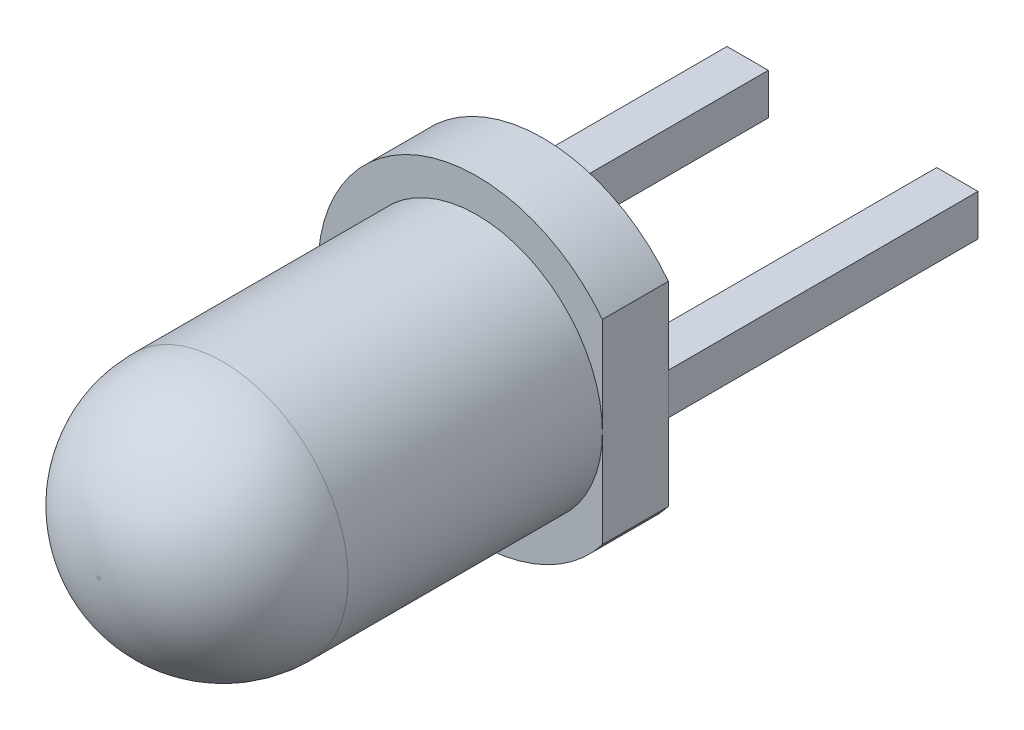
ISO-10303-21;
HEADER;
FILE_DESCRIPTION(('STEP AP214'),'2;1');
FILE_NAME('part.step','',(''),(''),'','','');
FILE_SCHEMA(('AUTOMOTIVE_DESIGN { 1 0 10303 214 1 1 1 1 }'));
ENDSEC;
DATA;
#1=APPLICATION_CONTEXT('core data for automotive mechanical design processes');
#2=APPLICATION_PROTOCOL_DEFINITION('international standard','automotive_design',2000,#1);
#3=PRODUCT_CONTEXT('',#1,'mechanical');
#4=PRODUCT('Part','Part','',(#3));
#5=PRODUCT_RELATED_PRODUCT_CATEGORY('part','',(#4));
#6=PRODUCT_DEFINITION_FORMATION('','',#4);
#7=PRODUCT_DEFINITION_CONTEXT('part definition',#1,'design');
#8=PRODUCT_DEFINITION('design','',#6,#7);
#9=PRODUCT_DEFINITION_SHAPE('','',#8);
#10=(LENGTH_UNIT() NAMED_UNIT(*) SI_UNIT(.MILLI.,.METRE.));
#11=(NAMED_UNIT(*) PLANE_ANGLE_UNIT() SI_UNIT($,.RADIAN.));
#12=(NAMED_UNIT(*) SI_UNIT($,.STERADIAN.) SOLID_ANGLE_UNIT());
#13=UNCERTAINTY_MEASURE_WITH_UNIT(LENGTH_MEASURE(1.E-05),#10,'distance_accuracy_value','');
#14=(GEOMETRIC_REPRESENTATION_CONTEXT(3) GLOBAL_UNCERTAINTY_ASSIGNED_CONTEXT((#13)) GLOBAL_UNIT_ASSIGNED_CONTEXT((#10,
#11,#12)) REPRESENTATION_CONTEXT('',''));
#15=CARTESIAN_POINT('',(0.,0.,0.));
#16=DIRECTION('',(0.,0.,1.));
#17=DIRECTION('',(1.,0.,0.));
#18=AXIS2_PLACEMENT_3D('',#15,#16,#17);
#19=CARTESIAN_POINT('',(0.,0.,5.39));
#20=DIRECTION('',(0.,0.,1.));
#21=DIRECTION('',(1.,0.,0.));
#22=AXIS2_PLACEMENT_3D('',#19,#20,#21);
#23=PLANE('',#22);
#24=CARTESIAN_POINT('',(0.,0.,5.39));
#25=DIRECTION('',(0.,0.,1.));
#26=DIRECTION('',(1.,0.,0.));
#27=AXIS2_PLACEMENT_3D('',#24,#25,#26);
#28=CIRCLE('',#27,0.02);
#29=CARTESIAN_POINT('',(0.02,0.,5.39));
#30=VERTEX_POINT('',#29);
#31=EDGE_CURVE('P0_E11',#30,#30,#28,.T.);
#32=ORIENTED_EDGE('',*,*,#31,.T.);
#33=EDGE_LOOP('',(#32));
#34=FACE_BOUND('',#33,.T.);
#35=ADVANCED_FACE('P0_F16',(#34),#23,.T.);
#36=CARTESIAN_POINT('',(1.52,0.,3.89));
#37=CARTESIAN_POINT('',(1.52,0.,4.125619449019));
#38=CARTESIAN_POINT('',(1.473746610581,0.,4.361242630973));
#39=CARTESIAN_POINT('',(1.381172946414,0.,4.584735226524));
#40=CARTESIAN_POINT('',(1.247268281961,0.,4.784052061599));
#41=CARTESIAN_POINT('',(0.914052061599,0.,5.117268281961));
#42=CARTESIAN_POINT('',(0.714735226524,0.,5.251172946414));
#43=CARTESIAN_POINT('',(0.491242630973,0.,5.343746610581));
#44=CARTESIAN_POINT('',(0.255619449019,0.,5.39));
#45=CARTESIAN_POINT('',(0.02,0.,5.39));
#46=(BOUNDED_CURVE() B_SPLINE_CURVE(5,(#36,#37,#38,#39,#40,#41,#42,#43,#44,#45),.UNSPECIFIED.,
.F.,.F.) B_SPLINE_CURVE_WITH_KNOTS((6,4,6),(0.,0.785398163397,1.570796326795),
.UNSPECIFIED.) CURVE() GEOMETRIC_REPRESENTATION_ITEM() RATIONAL_B_SPLINE_CURVE((1.,1.,1.,1.,1.,
1.,1.,1.,1.,1.)) REPRESENTATION_ITEM(''));
#47=CARTESIAN_POINT('',(0.,0.,3.89));
#48=DIRECTION('',(0.,0.,-1.));
#49=AXIS1_PLACEMENT('',#47,#48);
#50=SURFACE_OF_REVOLUTION('',#46,#49);
#51=CARTESIAN_POINT('',(0.02,0.,3.89));
#52=DIRECTION('',(0.,-1.,0.));
#53=DIRECTION('',(1.,0.,0.));
#54=AXIS2_PLACEMENT_3D('',#51,#52,#53);
#55=CIRCLE('',#54,1.5);
#56=CARTESIAN_POINT('',(1.52,0.,3.89));
#57=VERTEX_POINT('',#56);
#58=EDGE_CURVE('P0_E27',#57,#30,#55,.T.);
#59=ORIENTED_EDGE('',*,*,#58,.F.);
#60=CARTESIAN_POINT('',(0.,0.,3.89));
#61=DIRECTION('',(0.,0.,1.));
#62=DIRECTION('',(1.,0.,0.));
#63=AXIS2_PLACEMENT_3D('',#60,#61,#62);
#64=CIRCLE('',#63,1.52);
#65=EDGE_CURVE('P0_E243',#57,#57,#64,.T.);
#66=ORIENTED_EDGE('',*,*,#65,.T.);
#67=ORIENTED_EDGE('',*,*,#58,.T.);
#68=ORIENTED_EDGE('',*,*,#31,.F.);
#69=EDGE_LOOP('',(#59,#66,#67,#68));
#70=FACE_BOUND('',#69,.T.);
#71=ADVANCED_FACE('P0_F491',(#70),#50,.F.);
#72=CARTESIAN_POINT('',(0.04710743554143,0.,0.01));
#73=DIRECTION('',(0.,0.,-1.));
#74=DIRECTION('',(0.,-1.,0.));
#75=AXIS2_PLACEMENT_3D('',#72,#73,#74);
#76=PLANE('',#75);
#77=DIRECTION('',(1.,0.,0.));
#78=VECTOR('',#77,1.);
#79=CARTESIAN_POINT('',(-1.52,-0.25,0.01));
#80=LINE('',#79,#78);
#81=CARTESIAN_POINT('',(-1.52,-0.25,0.01));
#82=VERTEX_POINT('',#81);
#83=CARTESIAN_POINT('',(-1.02,-0.25,0.01));
#84=VERTEX_POINT('',#83);
#85=EDGE_CURVE('P0_E244',#82,#84,#80,.T.);
#86=ORIENTED_EDGE('',*,*,#85,.F.);
#87=DIRECTION('',(0.,-1.,0.));
#88=VECTOR('',#87,1.);
#89=CARTESIAN_POINT('',(-1.52,0.25,0.01));
#90=LINE('',#89,#88);
#91=CARTESIAN_POINT('',(-1.52,0.25,0.01));
#92=VERTEX_POINT('',#91);
#93=EDGE_CURVE('P0_E367',#92,#82,#90,.T.);
#94=ORIENTED_EDGE('',*,*,#93,.F.);
#95=DIRECTION('',(-1.,0.,0.));
#96=VECTOR('',#95,1.);
#97=CARTESIAN_POINT('',(-1.02,0.25,0.01));
#98=LINE('',#97,#96);
#99=CARTESIAN_POINT('',(-1.02,0.25,0.01));
#100=VERTEX_POINT('',#99);
#101=EDGE_CURVE('P0_E326',#100,#92,#98,.T.);
#102=ORIENTED_EDGE('',*,*,#101,.F.);
#103=DIRECTION('',(0.,1.,0.));
#104=VECTOR('',#103,1.);
#105=CARTESIAN_POINT('',(-1.02,-0.25,0.01));
#106=LINE('',#105,#104);
#107=EDGE_CURVE('P0_E348',#84,#100,#106,.T.);
#108=ORIENTED_EDGE('',*,*,#107,.F.);
#109=EDGE_LOOP('',(#86,#94,#102,#108));
#110=FACE_BOUND('',#109,.T.);
#111=ADVANCED_FACE('P0_F496',(#110),#76,.T.);
#112=CARTESIAN_POINT('',(0.,0.,0.81));
#113=DIRECTION('',(0.,0.,-1.));
#114=DIRECTION('',(1.,0.,0.));
#115=AXIS2_PLACEMENT_3D('',#112,#113,#114);
#116=CYLINDRICAL_SURFACE('',#115,1.52);
#117=CARTESIAN_POINT('',(0.,0.,0.81));
#118=DIRECTION('',(0.,0.,1.));
#119=DIRECTION('',(1.,0.,0.));
#120=AXIS2_PLACEMENT_3D('',#117,#118,#119);
#121=CIRCLE('',#120,1.52);
#122=CARTESIAN_POINT('',(1.52,0.,0.81));
#123=VERTEX_POINT('',#122);
#124=EDGE_CURVE('P0_E274',#123,#123,#121,.T.);
#125=ORIENTED_EDGE('',*,*,#124,.T.);
#126=DIRECTION('',(0.,0.,1.));
#127=VECTOR('',#126,1.);
#128=CARTESIAN_POINT('',(1.52,0.,0.81));
#129=LINE('',#128,#127);
#130=EDGE_CURVE('P0_E239',#123,#57,#129,.T.);
#131=ORIENTED_EDGE('',*,*,#130,.T.);
#132=ORIENTED_EDGE('',*,*,#65,.F.);
#133=ORIENTED_EDGE('',*,*,#130,.F.);
#134=EDGE_LOOP('',(#125,#131,#132,#133));
#135=FACE_BOUND('',#134,.T.);
#136=ADVANCED_FACE('P0_F505',(#135),#116,.T.);
#137=CARTESIAN_POINT('',(-1.52,-0.25,0.01));
#138=DIRECTION('',(0.,1.,0.));
#139=DIRECTION('',(1.,0.,0.));
#140=AXIS2_PLACEMENT_3D('',#137,#138,#139);
#141=PLANE('',#140);
#142=ORIENTED_EDGE('',*,*,#85,.T.);
#143=DIRECTION('',(0.,0.,1.));
#144=VECTOR('',#143,1.);
#145=CARTESIAN_POINT('',(-1.02,-0.25,0.01));
#146=LINE('',#145,#144);
#147=CARTESIAN_POINT('',(-1.02,-0.25,0.011));
#148=VERTEX_POINT('',#147);
#149=EDGE_CURVE('P0_E351',#84,#148,#146,.T.);
#150=ORIENTED_EDGE('',*,*,#149,.T.);
#151=DIRECTION('',(1.,0.,0.));
#152=VECTOR('',#151,1.);
#153=CARTESIAN_POINT('',(-1.52,-0.25,0.011));
#154=LINE('',#153,#152);
#155=CARTESIAN_POINT('',(-1.52,-0.25,0.011));
#156=VERTEX_POINT('',#155);
#157=EDGE_CURVE('P0_E267',#156,#148,#154,.T.);
#158=ORIENTED_EDGE('',*,*,#157,.F.);
#159=DIRECTION('',(0.,0.,1.));
#160=VECTOR('',#159,1.);
#161=CARTESIAN_POINT('',(-1.52,-0.25,0.01));
#162=LINE('',#161,#160);
#163=EDGE_CURVE('P0_E295',#82,#156,#162,.T.);
#164=ORIENTED_EDGE('',*,*,#163,.F.);
#165=EDGE_LOOP('',(#142,#150,#158,#164));
#166=FACE_BOUND('',#165,.T.);
#167=ADVANCED_FACE('P0_F508',(#166),#141,.F.);
#168=CARTESIAN_POINT('',(-1.52,0.25,0.01));
#169=DIRECTION('',(1.,0.,0.));
#170=DIRECTION('',(0.,1.,0.));
#171=AXIS2_PLACEMENT_3D('',#168,#169,#170);
#172=PLANE('',#171);
#173=ORIENTED_EDGE('',*,*,#93,.T.);
#174=ORIENTED_EDGE('',*,*,#163,.T.);
#175=DIRECTION('',(0.,-1.,0.));
#176=VECTOR('',#175,1.);
#177=CARTESIAN_POINT('',(-1.52,0.25,0.011));
#178=LINE('',#177,#176);
#179=CARTESIAN_POINT('',(-1.52,0.25,0.011));
#180=VERTEX_POINT('',#179);
#181=EDGE_CURVE('P0_E334',#180,#156,#178,.T.);
#182=ORIENTED_EDGE('',*,*,#181,.F.);
#183=DIRECTION('',(0.,0.,1.));
#184=VECTOR('',#183,1.);
#185=CARTESIAN_POINT('',(-1.52,0.25,0.01));
#186=LINE('',#185,#184);
#187=EDGE_CURVE('P0_E330',#92,#180,#186,.T.);
#188=ORIENTED_EDGE('',*,*,#187,.F.);
#189=EDGE_LOOP('',(#173,#174,#182,#188));
#190=FACE_BOUND('',#189,.T.);
#191=ADVANCED_FACE('P0_F522',(#190),#172,.F.);
#192=CARTESIAN_POINT('',(-1.02,-0.25,0.01));
#193=DIRECTION('',(-1.,0.,0.));
#194=DIRECTION('',(0.,0.,1.));
#195=AXIS2_PLACEMENT_3D('',#192,#193,#194);
#196=PLANE('',#195);
#197=ORIENTED_EDGE('',*,*,#107,.T.);
#198=DIRECTION('',(0.,0.,1.));
#199=VECTOR('',#198,1.);
#200=CARTESIAN_POINT('',(-1.02,0.25,0.01));
#201=LINE('',#200,#199);
#202=CARTESIAN_POINT('',(-1.02,0.25,0.011));
#203=VERTEX_POINT('',#202);
#204=EDGE_CURVE('P0_E352',#100,#203,#201,.T.);
#205=ORIENTED_EDGE('',*,*,#204,.T.);
#206=DIRECTION('',(0.,1.,0.));
#207=VECTOR('',#206,1.);
#208=CARTESIAN_POINT('',(-1.02,-0.25,0.011));
#209=LINE('',#208,#207);
#210=EDGE_CURVE('P0_E324',#148,#203,#209,.T.);
#211=ORIENTED_EDGE('',*,*,#210,.F.);
#212=ORIENTED_EDGE('',*,*,#149,.F.);
#213=EDGE_LOOP('',(#197,#205,#211,#212));
#214=FACE_BOUND('',#213,.T.);
#215=ADVANCED_FACE('P0_F501',(#214),#196,.F.);
#216=CARTESIAN_POINT('',(-1.02,0.25,0.01));
#217=DIRECTION('',(0.,-1.,0.));
#218=DIRECTION('',(0.,0.,-1.));
#219=AXIS2_PLACEMENT_3D('',#216,#217,#218);
#220=PLANE('',#219);
#221=ORIENTED_EDGE('',*,*,#101,.T.);
#222=ORIENTED_EDGE('',*,*,#187,.T.);
#223=DIRECTION('',(-1.,0.,0.));
#224=VECTOR('',#223,1.);
#225=CARTESIAN_POINT('',(-1.02,0.25,0.011));
#226=LINE('',#225,#224);
#227=EDGE_CURVE('P0_E229',#203,#180,#226,.T.);
#228=ORIENTED_EDGE('',*,*,#227,.F.);
#229=ORIENTED_EDGE('',*,*,#204,.F.);
#230=EDGE_LOOP('',(#221,#222,#228,#229));
#231=FACE_BOUND('',#230,.T.);
#232=ADVANCED_FACE('P0_F550',(#231),#220,.F.);
#233=CARTESIAN_POINT('',(0.04710743554143,0.,0.81));
#234=DIRECTION('',(0.,0.,-1.));
#235=DIRECTION('',(0.,-1.,0.));
#236=AXIS2_PLACEMENT_3D('',#233,#234,#235);
#237=PLANE('',#236);
#238=DIRECTION('',(0.,-1.,0.));
#239=VECTOR('',#238,1.);
#240=CARTESIAN_POINT('',(1.52,1.181196427357,0.81));
#241=LINE('',#240,#239);
#242=CARTESIAN_POINT('',(1.52,-1.181196427357,0.81));
#243=VERTEX_POINT('',#242);
#244=EDGE_CURVE('P0_E223',#123,#243,#241,.T.);
#245=ORIENTED_EDGE('',*,*,#244,.F.);
#246=ORIENTED_EDGE('',*,*,#124,.F.);
#247=DIRECTION('',(0.,-1.,0.));
#248=VECTOR('',#247,1.);
#249=CARTESIAN_POINT('',(1.52,1.181196427357,0.81));
#250=LINE('',#249,#248);
#251=CARTESIAN_POINT('',(1.52,1.181196427357,0.81));
#252=VERTEX_POINT('',#251);
#253=EDGE_CURVE('P0_E218',#252,#123,#250,.T.);
#254=ORIENTED_EDGE('',*,*,#253,.F.);
#255=CARTESIAN_POINT('',(0.,0.,0.81));
#256=DIRECTION('',(0.,0.,1.));
#257=DIRECTION('',(1.,0.,0.));
#258=AXIS2_PLACEMENT_3D('',#255,#256,#257);
#259=CIRCLE('',#258,1.925);
#260=EDGE_CURVE('P0_E307',#252,#243,#259,.T.);
#261=ORIENTED_EDGE('',*,*,#260,.T.);
#262=EDGE_LOOP('',(#245,#246,#254,#261));
#263=FACE_BOUND('',#262,.T.);
#264=ADVANCED_FACE('P0_F553',(#263),#237,.F.);
#265=CARTESIAN_POINT('',(-1.52,-0.349,0.011));
#266=DIRECTION('',(1.,0.,0.));
#267=DIRECTION('',(0.,0.,1.));
#268=AXIS2_PLACEMENT_3D('',#265,#266,#267);
#269=CYLINDRICAL_SURFACE('',#268,0.099);
#270=CARTESIAN_POINT('',(-1.619,-0.349,0.011));
#271=DIRECTION('',(-0.707106781186548,0.707106781186548,0.));
#272=DIRECTION('',(0.707106781186548,0.707106781186548,0.));
#273=AXIS2_PLACEMENT_3D('',#270,#271,#272);
#274=ELLIPSE('',#273,0.140007142675,0.099);
#275=CARTESIAN_POINT('',(-1.619,-0.349,0.11));
#276=VERTEX_POINT('',#275);
#277=EDGE_CURVE('P0_E275',#276,#156,#274,.T.);
#278=ORIENTED_EDGE('',*,*,#277,.T.);
#279=ORIENTED_EDGE('',*,*,#157,.T.);
#280=CARTESIAN_POINT('',(-0.921,-0.349,0.011));
#281=DIRECTION('',(-0.707106781186548,-0.707106781186548,0.));
#282=DIRECTION('',(-0.707106781186548,0.707106781186548,0.));
#283=AXIS2_PLACEMENT_3D('',#280,#281,#282);
#284=ELLIPSE('',#283,0.140007142675,0.099);
#285=CARTESIAN_POINT('',(-0.921,-0.349,0.11));
#286=VERTEX_POINT('',#285);
#287=EDGE_CURVE('P0_E228',#286,#148,#284,.T.);
#288=ORIENTED_EDGE('',*,*,#287,.F.);
#289=DIRECTION('',(1.,0.,0.));
#290=VECTOR('',#289,1.);
#291=CARTESIAN_POINT('',(-1.52,-0.349,0.11));
#292=LINE('',#291,#290);
#293=EDGE_CURVE('P0_E249',#276,#286,#292,.T.);
#294=ORIENTED_EDGE('',*,*,#293,.F.);
#295=EDGE_LOOP('',(#278,#279,#288,#294));
#296=FACE_BOUND('',#295,.T.);
#297=ADVANCED_FACE('P0_F516',(#296),#269,.F.);
#298=CARTESIAN_POINT('',(-1.619,0.25,0.011));
#299=DIRECTION('',(0.,-1.,0.));
#300=DIRECTION('',(0.,0.,1.));
#301=AXIS2_PLACEMENT_3D('',#298,#299,#300);
#302=CYLINDRICAL_SURFACE('',#301,0.099);
#303=CARTESIAN_POINT('',(-1.619,0.349,0.011));
#304=DIRECTION('',(0.707106781186548,0.707106781186548,0.));
#305=DIRECTION('',(-0.707106781186548,0.707106781186548,0.));
#306=AXIS2_PLACEMENT_3D('',#303,#304,#305);
#307=ELLIPSE('',#306,0.140007142675,0.099);
#308=CARTESIAN_POINT('',(-1.619,0.349,0.11));
#309=VERTEX_POINT('',#308);
#310=EDGE_CURVE('P0_E224',#309,#180,#307,.T.);
#311=ORIENTED_EDGE('',*,*,#310,.T.);
#312=ORIENTED_EDGE('',*,*,#181,.T.);
#313=ORIENTED_EDGE('',*,*,#277,.F.);
#314=DIRECTION('',(0.,-1.,0.));
#315=VECTOR('',#314,1.);
#316=CARTESIAN_POINT('',(-1.619,0.25,0.11));
#317=LINE('',#316,#315);
#318=EDGE_CURVE('P0_E254',#309,#276,#317,.T.);
#319=ORIENTED_EDGE('',*,*,#318,.F.);
#320=EDGE_LOOP('',(#311,#312,#313,#319));
#321=FACE_BOUND('',#320,.T.);
#322=ADVANCED_FACE('P0_F512',(#321),#302,.F.);
#323=CARTESIAN_POINT('',(-0.921,-0.25,0.011));
#324=DIRECTION('',(0.,1.,0.));
#325=DIRECTION('',(0.,0.,1.));
#326=AXIS2_PLACEMENT_3D('',#323,#324,#325);
#327=CYLINDRICAL_SURFACE('',#326,0.099);
#328=ORIENTED_EDGE('',*,*,#287,.T.);
#329=ORIENTED_EDGE('',*,*,#210,.T.);
#330=CARTESIAN_POINT('',(-0.921,0.349,0.011));
#331=DIRECTION('',(0.707106781186548,-0.707106781186548,0.));
#332=DIRECTION('',(-0.707106781186548,-0.707106781186548,0.));
#333=AXIS2_PLACEMENT_3D('',#330,#331,#332);
#334=ELLIPSE('',#333,0.140007142675,0.099);
#335=CARTESIAN_POINT('',(-0.921,0.349,0.11));
#336=VERTEX_POINT('',#335);
#337=EDGE_CURVE('P0_E337',#336,#203,#334,.T.);
#338=ORIENTED_EDGE('',*,*,#337,.F.);
#339=DIRECTION('',(0.,1.,0.));
#340=VECTOR('',#339,1.);
#341=CARTESIAN_POINT('',(-0.921,-0.25,0.11));
#342=LINE('',#341,#340);
#343=EDGE_CURVE('P0_E253',#286,#336,#342,.T.);
#344=ORIENTED_EDGE('',*,*,#343,.F.);
#345=EDGE_LOOP('',(#328,#329,#338,#344));
#346=FACE_BOUND('',#345,.T.);
#347=ADVANCED_FACE('P0_F515',(#346),#327,.F.);
#348=CARTESIAN_POINT('',(-1.02,0.349,0.011));
#349=DIRECTION('',(-1.,0.,0.));
#350=DIRECTION('',(0.,0.,1.));
#351=AXIS2_PLACEMENT_3D('',#348,#349,#350);
#352=CYLINDRICAL_SURFACE('',#351,0.099);
#353=ORIENTED_EDGE('',*,*,#337,.T.);
#354=ORIENTED_EDGE('',*,*,#227,.T.);
#355=ORIENTED_EDGE('',*,*,#310,.F.);
#356=DIRECTION('',(-1.,0.,0.));
#357=VECTOR('',#356,1.);
#358=CARTESIAN_POINT('',(-1.02,0.349,0.11));
#359=LINE('',#358,#357);
#360=EDGE_CURVE('P0_E255',#336,#309,#359,.T.);
#361=ORIENTED_EDGE('',*,*,#360,.F.);
#362=EDGE_LOOP('',(#353,#354,#355,#361));
#363=FACE_BOUND('',#362,.T.);
#364=ADVANCED_FACE('P0_F548',(#363),#352,.F.);
#365=CARTESIAN_POINT('',(0.921,-0.25,0.011));
#366=DIRECTION('',(0.,1.,0.));
#367=DIRECTION('',(1.,0.,0.));
#368=AXIS2_PLACEMENT_3D('',#365,#366,#367);
#369=CYLINDRICAL_SURFACE('',#368,0.099);
#370=CARTESIAN_POINT('',(0.921,-0.349,0.011));
#371=DIRECTION('',(0.707106781186548,-0.707106781186548,0.));
#372=DIRECTION('',(0.707106781186548,0.707106781186548,0.));
#373=AXIS2_PLACEMENT_3D('',#370,#371,#372);
#374=ELLIPSE('',#373,0.140007142675,0.099);
#375=CARTESIAN_POINT('',(1.02,-0.25,0.011));
#376=VERTEX_POINT('',#375);
#377=CARTESIAN_POINT('',(0.921,-0.349,0.11));
#378=VERTEX_POINT('',#377);
#379=EDGE_CURVE('P0_E405',#376,#378,#374,.T.);
#380=ORIENTED_EDGE('',*,*,#379,.T.);
#381=DIRECTION('',(0.,1.,0.));
#382=VECTOR('',#381,1.);
#383=CARTESIAN_POINT('',(0.921,-0.25,0.11));
#384=LINE('',#383,#382);
#385=CARTESIAN_POINT('',(0.921,0.349,0.11));
#386=VERTEX_POINT('',#385);
#387=EDGE_CURVE('P0_E238',#378,#386,#384,.T.);
#388=ORIENTED_EDGE('',*,*,#387,.T.);
#389=CARTESIAN_POINT('',(0.921,0.349,0.011));
#390=DIRECTION('',(-0.707106781186548,-0.707106781186548,0.));
#391=DIRECTION('',(-0.707106781186548,0.707106781186548,0.));
#392=AXIS2_PLACEMENT_3D('',#389,#390,#391);
#393=ELLIPSE('',#392,0.140007142675,0.099);
#394=CARTESIAN_POINT('',(1.02,0.25,0.011));
#395=VERTEX_POINT('',#394);
#396=EDGE_CURVE('P0_E20',#395,#386,#393,.T.);
#397=ORIENTED_EDGE('',*,*,#396,.F.);
#398=DIRECTION('',(0.,1.,0.));
#399=VECTOR('',#398,1.);
#400=CARTESIAN_POINT('',(1.02,-0.25,0.011));
#401=LINE('',#400,#399);
#402=EDGE_CURVE('P0_E306',#376,#395,#401,.T.);
#403=ORIENTED_EDGE('',*,*,#402,.F.);
#404=EDGE_LOOP('',(#380,#388,#397,#403));
#405=FACE_BOUND('',#404,.T.);
#406=ADVANCED_FACE('P0_F18',(#405),#369,.F.);
#407=CARTESIAN_POINT('',(1.02,0.349,0.011));
#408=DIRECTION('',(1.,0.,0.));
#409=DIRECTION('',(0.,-1.,0.));
#410=AXIS2_PLACEMENT_3D('',#407,#408,#409);
#411=CYLINDRICAL_SURFACE('',#410,0.099);
#412=ORIENTED_EDGE('',*,*,#396,.T.);
#413=DIRECTION('',(1.,0.,0.));
#414=VECTOR('',#413,1.);
#415=CARTESIAN_POINT('',(1.02,0.349,0.11));
#416=LINE('',#415,#414);
#417=CARTESIAN_POINT('',(1.321,0.349,0.11));
#418=VERTEX_POINT('',#417);
#419=EDGE_CURVE('P0_E234',#386,#418,#416,.T.);
#420=ORIENTED_EDGE('',*,*,#419,.T.);
#421=CARTESIAN_POINT('',(1.321,0.349,0.011));
#422=DIRECTION('',(-0.707106781186548,-0.707106781186548,0.));
#423=DIRECTION('',(-0.707106781186548,0.707106781186548,0.));
#424=AXIS2_PLACEMENT_3D('',#421,#422,#423);
#425=ELLIPSE('',#424,0.140007142675,0.099);
#426=CARTESIAN_POINT('',(1.42,0.25,0.011));
#427=VERTEX_POINT('',#426);
#428=EDGE_CURVE('P0_E219',#427,#418,#425,.T.);
#429=ORIENTED_EDGE('',*,*,#428,.F.);
#430=DIRECTION('',(1.,0.,0.));
#431=VECTOR('',#430,1.);
#432=CARTESIAN_POINT('',(1.02,0.25,0.011));
#433=LINE('',#432,#431);
#434=EDGE_CURVE('P0_E304',#395,#427,#433,.T.);
#435=ORIENTED_EDGE('',*,*,#434,.F.);
#436=EDGE_LOOP('',(#412,#420,#429,#435));
#437=FACE_BOUND('',#436,.T.);
#438=ADVANCED_FACE('P0_F474',(#437),#411,.F.);
#439=CARTESIAN_POINT('',(1.42,-0.349,0.011));
#440=DIRECTION('',(-1.,0.,0.));
#441=DIRECTION('',(0.,1.,0.));
#442=AXIS2_PLACEMENT_3D('',#439,#440,#441);
#443=CYLINDRICAL_SURFACE('',#442,0.099);
#444=CARTESIAN_POINT('',(1.321,-0.349,0.011));
#445=DIRECTION('',(0.707106781186548,-0.707106781186548,0.));
#446=DIRECTION('',(0.707106781186548,0.707106781186548,0.));
#447=AXIS2_PLACEMENT_3D('',#444,#445,#446);
#448=ELLIPSE('',#447,0.140007142675,0.099);
#449=CARTESIAN_POINT('',(1.42,-0.25,0.011));
#450=VERTEX_POINT('',#449);
#451=CARTESIAN_POINT('',(1.321,-0.349,0.11));
#452=VERTEX_POINT('',#451);
#453=EDGE_CURVE('P0_E359',#450,#452,#448,.T.);
#454=ORIENTED_EDGE('',*,*,#453,.T.);
#455=DIRECTION('',(-1.,0.,0.));
#456=VECTOR('',#455,1.);
#457=CARTESIAN_POINT('',(1.42,-0.349,0.11));
#458=LINE('',#457,#456);
#459=EDGE_CURVE('P0_E259',#452,#378,#458,.T.);
#460=ORIENTED_EDGE('',*,*,#459,.T.);
#461=ORIENTED_EDGE('',*,*,#379,.F.);
#462=DIRECTION('',(-1.,0.,0.));
#463=VECTOR('',#462,1.);
#464=CARTESIAN_POINT('',(1.42,-0.25,0.011));
#465=LINE('',#464,#463);
#466=EDGE_CURVE('P0_E180',#450,#376,#465,.T.);
#467=ORIENTED_EDGE('',*,*,#466,.F.);
#468=EDGE_LOOP('',(#454,#460,#461,#467));
#469=FACE_BOUND('',#468,.T.);
#470=ADVANCED_FACE('P0_F479',(#469),#443,.F.);
#471=CARTESIAN_POINT('',(1.02,-0.25,0.01));
#472=DIRECTION('',(-1.,0.,0.));
#473=DIRECTION('',(0.,0.,1.));
#474=AXIS2_PLACEMENT_3D('',#471,#472,#473);
#475=PLANE('',#474);
#476=DIRECTION('',(0.,0.,1.));
#477=VECTOR('',#476,1.);
#478=CARTESIAN_POINT('',(1.02,-0.25,0.01));
#479=LINE('',#478,#477);
#480=CARTESIAN_POINT('',(1.02,-0.25,0.01));
#481=VERTEX_POINT('',#480);
#482=EDGE_CURVE('P0_E173',#481,#376,#479,.T.);
#483=ORIENTED_EDGE('',*,*,#482,.T.);
#484=ORIENTED_EDGE('',*,*,#402,.T.);
#485=DIRECTION('',(0.,0.,1.));
#486=VECTOR('',#485,1.);
#487=CARTESIAN_POINT('',(1.02,0.25,0.01));
#488=LINE('',#487,#486);
#489=CARTESIAN_POINT('',(1.02,0.25,0.01));
#490=VERTEX_POINT('',#489);
#491=EDGE_CURVE('P0_E190',#490,#395,#488,.T.);
#492=ORIENTED_EDGE('',*,*,#491,.F.);
#493=DIRECTION('',(0.,1.,0.));
#494=VECTOR('',#493,1.);
#495=CARTESIAN_POINT('',(1.02,-0.25,0.01));
#496=LINE('',#495,#494);
#497=EDGE_CURVE('P0_E187',#481,#490,#496,.T.);
#498=ORIENTED_EDGE('',*,*,#497,.F.);
#499=EDGE_LOOP('',(#483,#484,#492,#498));
#500=FACE_BOUND('',#499,.T.);
#501=ADVANCED_FACE('P0_F188',(#500),#475,.T.);
#502=CARTESIAN_POINT('',(1.02,0.25,0.01));
#503=DIRECTION('',(0.,1.,0.));
#504=DIRECTION('',(1.,0.,0.));
#505=AXIS2_PLACEMENT_3D('',#502,#503,#504);
#506=PLANE('',#505);
#507=ORIENTED_EDGE('',*,*,#491,.T.);
#508=ORIENTED_EDGE('',*,*,#434,.T.);
#509=DIRECTION('',(0.,0.,1.));
#510=VECTOR('',#509,1.);
#511=CARTESIAN_POINT('',(1.42,0.25,0.01));
#512=LINE('',#511,#510);
#513=CARTESIAN_POINT('',(1.42,0.25,0.01));
#514=VERTEX_POINT('',#513);
#515=EDGE_CURVE('P0_E342',#514,#427,#512,.T.);
#516=ORIENTED_EDGE('',*,*,#515,.F.);
#517=DIRECTION('',(1.,0.,0.));
#518=VECTOR('',#517,1.);
#519=CARTESIAN_POINT('',(1.02,0.25,0.01));
#520=LINE('',#519,#518);
#521=EDGE_CURVE('P0_E195',#490,#514,#520,.T.);
#522=ORIENTED_EDGE('',*,*,#521,.F.);
#523=EDGE_LOOP('',(#507,#508,#516,#522));
#524=FACE_BOUND('',#523,.T.);
#525=ADVANCED_FACE('P0_F473',(#524),#506,.T.);
#526=CARTESIAN_POINT('',(0.,0.,0.01));
#527=DIRECTION('',(0.,0.,-1.));
#528=DIRECTION('',(1.,0.,0.));
#529=AXIS2_PLACEMENT_3D('',#526,#527,#528);
#530=CYLINDRICAL_SURFACE('',#529,1.925);
#531=CARTESIAN_POINT('',(0.,0.,0.01));
#532=DIRECTION('',(0.,0.,1.));
#533=DIRECTION('',(1.,0.,0.));
#534=AXIS2_PLACEMENT_3D('',#531,#532,#533);
#535=CIRCLE('',#534,1.925);
#536=CARTESIAN_POINT('',(1.52,1.181196427357,0.01));
#537=VERTEX_POINT('',#536);
#538=CARTESIAN_POINT('',(1.52,-1.181196427357,0.01));
#539=VERTEX_POINT('',#538);
#540=EDGE_CURVE('P0_E203',#537,#539,#535,.T.);
#541=ORIENTED_EDGE('',*,*,#540,.T.);
#542=DIRECTION('',(0.,0.,1.));
#543=VECTOR('',#542,1.);
#544=CARTESIAN_POINT('',(1.52,-1.181196427357,0.01));
#545=LINE('',#544,#543);
#546=EDGE_CURVE('P0_E233',#539,#243,#545,.T.);
#547=ORIENTED_EDGE('',*,*,#546,.T.);
#548=ORIENTED_EDGE('',*,*,#260,.F.);
#549=DIRECTION('',(0.,0.,1.));
#550=VECTOR('',#549,1.);
#551=CARTESIAN_POINT('',(1.52,1.181196427357,0.01));
#552=LINE('',#551,#550);
#553=EDGE_CURVE('P0_E214',#537,#252,#552,.T.);
#554=ORIENTED_EDGE('',*,*,#553,.F.);
#555=EDGE_LOOP('',(#541,#547,#548,#554));
#556=FACE_BOUND('',#555,.T.);
#557=ADVANCED_FACE('P0_F529',(#556),#530,.T.);
#558=CARTESIAN_POINT('',(1.52,1.181196427357,0.01));
#559=DIRECTION('',(1.,0.,0.));
#560=DIRECTION('',(0.,1.,0.));
#561=AXIS2_PLACEMENT_3D('',#558,#559,#560);
#562=PLANE('',#561);
#563=ORIENTED_EDGE('',*,*,#553,.T.);
#564=ORIENTED_EDGE('',*,*,#253,.T.);
#565=ORIENTED_EDGE('',*,*,#244,.T.);
#566=ORIENTED_EDGE('',*,*,#546,.F.);
#567=DIRECTION('',(0.,-1.,0.));
#568=VECTOR('',#567,1.);
#569=CARTESIAN_POINT('',(1.52,1.181196427357,0.01));
#570=LINE('',#569,#568);
#571=EDGE_CURVE('P0_E210',#537,#539,#570,.T.);
#572=ORIENTED_EDGE('',*,*,#571,.F.);
#573=EDGE_LOOP('',(#563,#564,#565,#566,#572));
#574=FACE_BOUND('',#573,.T.);
#575=ADVANCED_FACE('P0_F527',(#574),#562,.T.);
#576=CARTESIAN_POINT('',(1.321,0.25,0.011));
#577=DIRECTION('',(0.,1.,0.));
#578=DIRECTION('',(1.,0.,0.));
#579=AXIS2_PLACEMENT_3D('',#576,#577,#578);
#580=CYLINDRICAL_SURFACE('',#579,0.099);
#581=ORIENTED_EDGE('',*,*,#428,.T.);
#582=DIRECTION('',(0.,1.,0.));
#583=VECTOR('',#582,1.);
#584=CARTESIAN_POINT('',(1.321,0.25,0.11));
#585=LINE('',#584,#583);
#586=CARTESIAN_POINT('',(1.321,1.110871279672,0.11));
#587=VERTEX_POINT('',#586);
#588=EDGE_CURVE('P0_E184',#418,#587,#585,.T.);
#589=ORIENTED_EDGE('',*,*,#588,.T.);
#590=CARTESIAN_POINT('',(1.42,1.146396528257,0.011));
#591=CARTESIAN_POINT('',(1.419999998987,1.146396526287,0.03125876072404));
#592=CARTESIAN_POINT('',(1.415163403371,1.14468787317,0.05151873587734));
#593=CARTESIAN_POINT('',(1.405489350111,1.141270101434,0.07039024741974));
#594=CARTESIAN_POINT('',(1.391478382053,1.136304591358,0.08648439233626));
#595=CARTESIAN_POINT('',(1.374130100074,1.130110658325,0.09866255670713));
#596=CARTESIAN_POINT('',(1.354746788412,1.123130825513,0.10624687926518));
#597=CARTESIAN_POINT('',(1.332753388435,1.115148305203,0.10931943723926));
#598=CARTESIAN_POINT('',(1.330802867535,1.114439841167,0.10954607495158));
#599=CARTESIAN_POINT('',(1.32884732283,1.11372902605,0.10972755842079));
#600=CARTESIAN_POINT('',(1.326888006457,1.113016309057,0.10986375763367));
#601=CARTESIAN_POINT('',(1.324926174052,1.112302142017,0.10995458593684));
#602=CARTESIAN_POINT('',(1.322963084756,1.111586979382,0.110000000037));
#603=CARTESIAN_POINT('',(1.321000001212,1.110871278231,0.11));
#604=(BOUNDED_CURVE() B_SPLINE_CURVE(7,(#590,#591,#592,#593,#594,#595,#596,#597,#598,#599,#600,
#601,#602,#603),.UNSPECIFIED.,.F.,.F.) B_SPLINE_CURVE_WITH_KNOTS((8,6,8),(0.,0.911598549296,1.),
.UNSPECIFIED.) CURVE() GEOMETRIC_REPRESENTATION_ITEM() RATIONAL_B_SPLINE_CURVE((1.,1.,1.,1.,1.,
1.,1.,1.,1.,1.,1.,1.,1.,1.)) REPRESENTATION_ITEM(''));
#605=CARTESIAN_POINT('',(1.42,1.146396528257,0.011));
#606=VERTEX_POINT('',#605);
#607=EDGE_CURVE('P0_E260',#606,#587,#604,.T.);
#608=ORIENTED_EDGE('',*,*,#607,.F.);
#609=DIRECTION('',(0.,1.,0.));
#610=VECTOR('',#609,1.);
#611=CARTESIAN_POINT('',(1.42,0.25,0.011));
#612=LINE('',#611,#610);
#613=EDGE_CURVE('P0_E346',#427,#606,#612,.T.);
#614=ORIENTED_EDGE('',*,*,#613,.F.);
#615=EDGE_LOOP('',(#581,#589,#608,#614));
#616=FACE_BOUND('',#615,.T.);
#617=ADVANCED_FACE('P0_F461',(#616),#580,.F.);
#618=CARTESIAN_POINT('',(0.106221193918,0.,0.11));
#619=DIRECTION('',(0.,0.,-1.));
#620=DIRECTION('',(0.,-1.,0.));
#621=AXIS2_PLACEMENT_3D('',#618,#619,#620);
#622=PLANE('',#621);
#623=ORIENTED_EDGE('',*,*,#360,.T.);
#624=ORIENTED_EDGE('',*,*,#318,.T.);
#625=ORIENTED_EDGE('',*,*,#293,.T.);
#626=ORIENTED_EDGE('',*,*,#343,.T.);
#627=EDGE_LOOP('',(#623,#624,#625,#626));
#628=FACE_BOUND('',#627,.T.);
#629=CARTESIAN_POINT('',(0.,0.,0.11));
#630=DIRECTION('',(0.,0.,-1.));
#631=DIRECTION('',(0.778082191780786,-0.628162481236828,0.));
#632=AXIS2_PLACEMENT_3D('',#629,#630,#631);
#633=CIRCLE('',#632,1.726);
#634=CARTESIAN_POINT('',(1.321,-1.110871279672,0.11));
#635=VERTEX_POINT('',#634);
#636=EDGE_CURVE('P0_E266',#635,#587,#633,.T.);
#637=ORIENTED_EDGE('',*,*,#636,.T.);
#638=ORIENTED_EDGE('',*,*,#588,.F.);
#639=ORIENTED_EDGE('',*,*,#419,.F.);
#640=ORIENTED_EDGE('',*,*,#387,.F.);
#641=ORIENTED_EDGE('',*,*,#459,.F.);
#642=DIRECTION('',(0.,1.,0.));
#643=VECTOR('',#642,1.);
#644=CARTESIAN_POINT('',(1.321,-1.146396528257,0.11));
#645=LINE('',#644,#643);
#646=EDGE_CURVE('P0_E355',#635,#452,#645,.T.);
#647=ORIENTED_EDGE('',*,*,#646,.F.);
#648=EDGE_LOOP('',(#637,#638,#639,#640,#641,#647));
#649=FACE_BOUND('',#648,.T.);
#650=ADVANCED_FACE('P0_F466',(#628,#649),#622,.T.);
#651=CARTESIAN_POINT('',(1.42,-0.25,0.01));
#652=DIRECTION('',(0.,-1.,0.));
#653=DIRECTION('',(0.,0.,-1.));
#654=AXIS2_PLACEMENT_3D('',#651,#652,#653);
#655=PLANE('',#654);
#656=DIRECTION('',(0.,0.,1.));
#657=VECTOR('',#656,1.);
#658=CARTESIAN_POINT('',(1.42,-0.25,0.01));
#659=LINE('',#658,#657);
#660=CARTESIAN_POINT('',(1.42,-0.25,0.01));
#661=VERTEX_POINT('',#660);
#662=EDGE_CURVE('P0_E248',#661,#450,#659,.T.);
#663=ORIENTED_EDGE('',*,*,#662,.T.);
#664=ORIENTED_EDGE('',*,*,#466,.T.);
#665=ORIENTED_EDGE('',*,*,#482,.F.);
#666=DIRECTION('',(-1.,0.,0.));
#667=VECTOR('',#666,1.);
#668=CARTESIAN_POINT('',(1.42,-0.25,0.01));
#669=LINE('',#668,#667);
#670=EDGE_CURVE('P0_E178',#661,#481,#669,.T.);
#671=ORIENTED_EDGE('',*,*,#670,.F.);
#672=EDGE_LOOP('',(#663,#664,#665,#671));
#673=FACE_BOUND('',#672,.T.);
#674=ADVANCED_FACE('P0_F176',(#673),#655,.T.);
#675=CARTESIAN_POINT('',(1.321,-1.146396528257,0.011));
#676=DIRECTION('',(0.,1.,0.));
#677=DIRECTION('',(1.,0.,0.));
#678=AXIS2_PLACEMENT_3D('',#675,#676,#677);
#679=CYLINDRICAL_SURFACE('',#678,0.099);
#680=CARTESIAN_POINT('',(1.42,-1.146396528257,0.011));
#681=CARTESIAN_POINT('',(1.419999998889,-1.146396526096,0.03322318387792));
#682=CARTESIAN_POINT('',(1.414179941378,-1.144340442402,0.05544795657592));
#683=CARTESIAN_POINT('',(1.402538606567,-1.140227613385,0.07584018826717));
#684=CARTESIAN_POINT('',(1.385800418067,-1.134291663529,0.09256529242793));
#685=CARTESIAN_POINT('',(1.365414407119,-1.126995015846,0.10418858395967));
#686=CARTESIAN_POINT('',(1.343206372936,-1.118967243934,0.110000040068));
#687=CARTESIAN_POINT('',(1.320999999937,-1.110871279747,0.11));
#688=(BOUNDED_CURVE() B_SPLINE_CURVE(7,(#680,#681,#682,#683,#684,#685,#686,#687),.UNSPECIFIED.,
.F.,.F.) B_SPLINE_CURVE_WITH_KNOTS((8,8),(0.,1.),
.UNSPECIFIED.) CURVE() GEOMETRIC_REPRESENTATION_ITEM() RATIONAL_B_SPLINE_CURVE((1.,1.,1.,1.,1.,
1.,1.,1.)) REPRESENTATION_ITEM(''));
#689=CARTESIAN_POINT('',(1.42,-1.146396528257,0.011));
#690=VERTEX_POINT('',#689);
#691=EDGE_CURVE('P0_E247',#690,#635,#688,.T.);
#692=ORIENTED_EDGE('',*,*,#691,.T.);
#693=ORIENTED_EDGE('',*,*,#646,.T.);
#694=ORIENTED_EDGE('',*,*,#453,.F.);
#695=DIRECTION('',(0.,1.,0.));
#696=VECTOR('',#695,1.);
#697=CARTESIAN_POINT('',(1.42,-1.146396528257,0.011));
#698=LINE('',#697,#696);
#699=EDGE_CURVE('P0_E300',#690,#450,#698,.T.);
#700=ORIENTED_EDGE('',*,*,#699,.F.);
#701=EDGE_LOOP('',(#692,#693,#694,#700));
#702=FACE_BOUND('',#701,.T.);
#703=ADVANCED_FACE('P0_F468',(#702),#679,.F.);
#704=CARTESIAN_POINT('',(1.42,0.25,0.01));
#705=DIRECTION('',(-1.,0.,0.));
#706=DIRECTION('',(0.,0.,1.));
#707=AXIS2_PLACEMENT_3D('',#704,#705,#706);
#708=PLANE('',#707);
#709=ORIENTED_EDGE('',*,*,#515,.T.);
#710=ORIENTED_EDGE('',*,*,#613,.T.);
#711=DIRECTION('',(0.,0.,1.));
#712=VECTOR('',#711,1.);
#713=CARTESIAN_POINT('',(1.42,1.146396528257,0.01));
#714=LINE('',#713,#712);
#715=CARTESIAN_POINT('',(1.42,1.146396528257,0.01));
#716=VERTEX_POINT('',#715);
#717=EDGE_CURVE('P0_E276',#716,#606,#714,.T.);
#718=ORIENTED_EDGE('',*,*,#717,.F.);
#719=DIRECTION('',(0.,1.,0.));
#720=VECTOR('',#719,1.);
#721=CARTESIAN_POINT('',(1.42,0.25,0.01));
#722=LINE('',#721,#720);
#723=EDGE_CURVE('P0_E347',#514,#716,#722,.T.);
#724=ORIENTED_EDGE('',*,*,#723,.F.);
#725=EDGE_LOOP('',(#709,#710,#718,#724));
#726=FACE_BOUND('',#725,.T.);
#727=ADVANCED_FACE('P0_F458',(#726),#708,.T.);
#728=CARTESIAN_POINT('',(0.04710743554143,0.,0.01));
#729=DIRECTION('',(0.,0.,-1.));
#730=DIRECTION('',(0.,-1.,0.));
#731=AXIS2_PLACEMENT_3D('',#728,#729,#730);
#732=PLANE('',#731);
#733=CARTESIAN_POINT('',(0.,0.,0.01));
#734=DIRECTION('',(0.,0.,-1.));
#735=DIRECTION('',(1.,0.,0.));
#736=AXIS2_PLACEMENT_3D('',#733,#734,#735);
#737=CIRCLE('',#736,1.825);
#738=CARTESIAN_POINT('',(1.42,-1.146396528257,0.01));
#739=VERTEX_POINT('',#738);
#740=EDGE_CURVE('P0_E281',#739,#716,#737,.T.);
#741=ORIENTED_EDGE('',*,*,#740,.F.);
#742=DIRECTION('',(0.,1.,0.));
#743=VECTOR('',#742,1.);
#744=CARTESIAN_POINT('',(1.42,-1.146396528257,0.01));
#745=LINE('',#744,#743);
#746=EDGE_CURVE('P0_E200',#739,#661,#745,.T.);
#747=ORIENTED_EDGE('',*,*,#746,.T.);
#748=ORIENTED_EDGE('',*,*,#670,.T.);
#749=ORIENTED_EDGE('',*,*,#497,.T.);
#750=ORIENTED_EDGE('',*,*,#521,.T.);
#751=ORIENTED_EDGE('',*,*,#723,.T.);
#752=EDGE_LOOP('',(#741,#747,#748,#749,#750,#751));
#753=FACE_BOUND('',#752,.T.);
#754=ORIENTED_EDGE('',*,*,#571,.T.);
#755=ORIENTED_EDGE('',*,*,#540,.F.);
#756=EDGE_LOOP('',(#754,#755));
#757=FACE_BOUND('',#756,.T.);
#758=ADVANCED_FACE('P0_F198',(#753,#757),#732,.T.);
#759=CARTESIAN_POINT('',(0.,0.,0.011));
#760=DIRECTION('',(0.,0.,1.));
#761=DIRECTION('',(0.778082191780786,-0.628162481236828,0.));
#762=AXIS2_PLACEMENT_3D('',#759,#760,#761);
#763=TOROIDAL_SURFACE('',#762,1.726,0.099);
#764=ORIENTED_EDGE('',*,*,#691,.F.);
#765=CARTESIAN_POINT('',(0.,0.,0.011));
#766=DIRECTION('',(0.,0.,-1.));
#767=DIRECTION('',(0.778082191780786,-0.628162481236828,0.));
#768=AXIS2_PLACEMENT_3D('',#765,#766,#767);
#769=CIRCLE('',#768,1.825);
#770=EDGE_CURVE('P0_E280',#690,#606,#769,.T.);
#771=ORIENTED_EDGE('',*,*,#770,.T.);
#772=ORIENTED_EDGE('',*,*,#607,.T.);
#773=ORIENTED_EDGE('',*,*,#636,.F.);
#774=EDGE_LOOP('',(#764,#771,#772,#773));
#775=FACE_BOUND('',#774,.T.);
#776=ADVANCED_FACE('P0_F448',(#775),#763,.F.);
#777=CARTESIAN_POINT('',(1.42,-1.146396528257,0.01));
#778=DIRECTION('',(-1.,0.,0.));
#779=DIRECTION('',(0.,0.,1.));
#780=AXIS2_PLACEMENT_3D('',#777,#778,#779);
#781=PLANE('',#780);
#782=DIRECTION('',(0.,0.,1.));
#783=VECTOR('',#782,1.);
#784=CARTESIAN_POINT('',(1.42,-1.146396528257,0.01));
#785=LINE('',#784,#783);
#786=EDGE_CURVE('P0_E296',#739,#690,#785,.T.);
#787=ORIENTED_EDGE('',*,*,#786,.T.);
#788=ORIENTED_EDGE('',*,*,#699,.T.);
#789=ORIENTED_EDGE('',*,*,#662,.F.);
#790=ORIENTED_EDGE('',*,*,#746,.F.);
#791=EDGE_LOOP('',(#787,#788,#789,#790));
#792=FACE_BOUND('',#791,.T.);
#793=ADVANCED_FACE('P0_F471',(#792),#781,.T.);
#794=CARTESIAN_POINT('',(0.,0.,0.01));
#795=DIRECTION('',(0.,0.,-1.));
#796=DIRECTION('',(1.,0.,0.));
#797=AXIS2_PLACEMENT_3D('',#794,#795,#796);
#798=CYLINDRICAL_SURFACE('',#797,1.825);
#799=ORIENTED_EDGE('',*,*,#740,.T.);
#800=ORIENTED_EDGE('',*,*,#717,.T.);
#801=ORIENTED_EDGE('',*,*,#770,.F.);
#802=ORIENTED_EDGE('',*,*,#786,.F.);
#803=EDGE_LOOP('',(#799,#800,#801,#802));
#804=FACE_BOUND('',#803,.T.);
#805=ADVANCED_FACE('P0_F455',(#804),#798,.F.);
#806=CLOSED_SHELL('',(#35,#71,#111,#136,#167,#191,#215,#232,#264,#297,#322,#347,#364,#406,#438,
#470,#501,#525,#557,#575,#617,#650,#674,#703,#727,#758,#776,#793,#805));
#807=MANIFOLD_SOLID_BREP('P0_B1',#806);
#808=CARTESIAN_POINT('',(-1.27,0.,-3.74));
#809=DIRECTION('',(0.,0.,1.));
#810=DIRECTION('',(1.,0.,0.));
#811=AXIS2_PLACEMENT_3D('',#808,#809,#810);
#812=PLANE('',#811);
#813=DIRECTION('',(0.,-1.,0.));
#814=VECTOR('',#813,1.);
#815=CARTESIAN_POINT('',(-1.52,0.25,-3.74));
#816=LINE('',#815,#814);
#817=CARTESIAN_POINT('',(-1.52,0.25,-3.74));
#818=VERTEX_POINT('',#817);
#819=CARTESIAN_POINT('',(-1.52,-0.25,-3.74));
#820=VERTEX_POINT('',#819);
#821=EDGE_CURVE('P1_E27',#818,#820,#816,.T.);
#822=ORIENTED_EDGE('',*,*,#821,.F.);
#823=DIRECTION('',(-1.,0.,0.));
#824=VECTOR('',#823,1.);
#825=CARTESIAN_POINT('',(-1.02,0.25,-3.74));
#826=LINE('',#825,#824);
#827=CARTESIAN_POINT('',(-1.02,0.25,-3.74));
#828=VERTEX_POINT('',#827);
#829=EDGE_CURVE('P1_E61',#828,#818,#826,.T.);
#830=ORIENTED_EDGE('',*,*,#829,.F.);
#831=DIRECTION('',(0.,1.,0.));
#832=VECTOR('',#831,1.);
#833=CARTESIAN_POINT('',(-1.02,-0.25,-3.74));
#834=LINE('',#833,#832);
#835=CARTESIAN_POINT('',(-1.02,-0.25,-3.74));
#836=VERTEX_POINT('',#835);
#837=EDGE_CURVE('P1_E87',#836,#828,#834,.T.);
#838=ORIENTED_EDGE('',*,*,#837,.F.);
#839=DIRECTION('',(1.,0.,0.));
#840=VECTOR('',#839,1.);
#841=CARTESIAN_POINT('',(-1.52,-0.25,-3.74));
#842=LINE('',#841,#840);
#843=EDGE_CURVE('P1_E91',#820,#836,#842,.T.);
#844=ORIENTED_EDGE('',*,*,#843,.F.);
#845=EDGE_LOOP('',(#822,#830,#838,#844));
#846=FACE_BOUND('',#845,.T.);
#847=ADVANCED_FACE('P1_F16',(#846),#812,.F.);
#848=CARTESIAN_POINT('',(-1.27,0.,0.01));
#849=DIRECTION('',(0.,0.,1.));
#850=DIRECTION('',(1.,0.,0.));
#851=AXIS2_PLACEMENT_3D('',#848,#849,#850);
#852=PLANE('',#851);
#853=DIRECTION('',(1.,0.,0.));
#854=VECTOR('',#853,1.);
#855=CARTESIAN_POINT('',(-1.52,-0.25,0.01));
#856=LINE('',#855,#854);
#857=CARTESIAN_POINT('',(-1.52,-0.25,0.01));
#858=VERTEX_POINT('',#857);
#859=CARTESIAN_POINT('',(-1.02,-0.25,0.01));
#860=VERTEX_POINT('',#859);
#861=EDGE_CURVE('P1_E83',#858,#860,#856,.T.);
#862=ORIENTED_EDGE('',*,*,#861,.T.);
#863=DIRECTION('',(0.,1.,0.));
#864=VECTOR('',#863,1.);
#865=CARTESIAN_POINT('',(-1.02,-0.25,0.01));
#866=LINE('',#865,#864);
#867=CARTESIAN_POINT('',(-1.02,0.25,0.01));
#868=VERTEX_POINT('',#867);
#869=EDGE_CURVE('P1_E20',#860,#868,#866,.T.);
#870=ORIENTED_EDGE('',*,*,#869,.T.);
#871=DIRECTION('',(-1.,0.,0.));
#872=VECTOR('',#871,1.);
#873=CARTESIAN_POINT('',(-1.02,0.25,0.01));
#874=LINE('',#873,#872);
#875=CARTESIAN_POINT('',(-1.52,0.25,0.01));
#876=VERTEX_POINT('',#875);
#877=EDGE_CURVE('P1_E106',#868,#876,#874,.T.);
#878=ORIENTED_EDGE('',*,*,#877,.T.);
#879=DIRECTION('',(0.,-1.,0.));
#880=VECTOR('',#879,1.);
#881=CARTESIAN_POINT('',(-1.52,0.25,0.01));
#882=LINE('',#881,#880);
#883=EDGE_CURVE('P1_E11',#876,#858,#882,.T.);
#884=ORIENTED_EDGE('',*,*,#883,.T.);
#885=EDGE_LOOP('',(#862,#870,#878,#884));
#886=FACE_BOUND('',#885,.T.);
#887=ADVANCED_FACE('P1_F18',(#886),#852,.T.);
#888=CARTESIAN_POINT('',(-1.52,0.25,0.01));
#889=DIRECTION('',(-1.,0.,0.));
#890=DIRECTION('',(0.,0.,1.));
#891=AXIS2_PLACEMENT_3D('',#888,#889,#890);
#892=PLANE('',#891);
#893=DIRECTION('',(0.,0.,-1.));
#894=VECTOR('',#893,1.);
#895=CARTESIAN_POINT('',(-1.52,0.25,0.01));
#896=LINE('',#895,#894);
#897=EDGE_CURVE('P1_E103',#876,#818,#896,.T.);
#898=ORIENTED_EDGE('',*,*,#897,.T.);
#899=ORIENTED_EDGE('',*,*,#821,.T.);
#900=DIRECTION('',(0.,0.,-1.));
#901=VECTOR('',#900,1.);
#902=CARTESIAN_POINT('',(-1.52,-0.25,0.01));
#903=LINE('',#902,#901);
#904=EDGE_CURVE('P1_E98',#858,#820,#903,.T.);
#905=ORIENTED_EDGE('',*,*,#904,.F.);
#906=ORIENTED_EDGE('',*,*,#883,.F.);
#907=EDGE_LOOP('',(#898,#899,#905,#906));
#908=FACE_BOUND('',#907,.T.);
#909=ADVANCED_FACE('P1_F123',(#908),#892,.T.);
#910=CARTESIAN_POINT('',(-1.02,0.25,0.01));
#911=DIRECTION('',(0.,1.,0.));
#912=DIRECTION('',(1.,0.,0.));
#913=AXIS2_PLACEMENT_3D('',#910,#911,#912);
#914=PLANE('',#913);
#915=DIRECTION('',(0.,0.,-1.));
#916=VECTOR('',#915,1.);
#917=CARTESIAN_POINT('',(-1.02,0.25,0.01));
#918=LINE('',#917,#916);
#919=EDGE_CURVE('P1_E79',#868,#828,#918,.T.);
#920=ORIENTED_EDGE('',*,*,#919,.T.);
#921=ORIENTED_EDGE('',*,*,#829,.T.);
#922=ORIENTED_EDGE('',*,*,#897,.F.);
#923=ORIENTED_EDGE('',*,*,#877,.F.);
#924=EDGE_LOOP('',(#920,#921,#922,#923));
#925=FACE_BOUND('',#924,.T.);
#926=ADVANCED_FACE('P1_F114',(#925),#914,.T.);
#927=CARTESIAN_POINT('',(-1.02,-0.25,0.01));
#928=DIRECTION('',(1.,0.,0.));
#929=DIRECTION('',(0.,1.,0.));
#930=AXIS2_PLACEMENT_3D('',#927,#928,#929);
#931=PLANE('',#930);
#932=DIRECTION('',(0.,0.,-1.));
#933=VECTOR('',#932,1.);
#934=CARTESIAN_POINT('',(-1.02,-0.25,0.01));
#935=LINE('',#934,#933);
#936=EDGE_CURVE('P1_E77',#860,#836,#935,.T.);
#937=ORIENTED_EDGE('',*,*,#936,.T.);
#938=ORIENTED_EDGE('',*,*,#837,.T.);
#939=ORIENTED_EDGE('',*,*,#919,.F.);
#940=ORIENTED_EDGE('',*,*,#869,.F.);
#941=EDGE_LOOP('',(#937,#938,#939,#940));
#942=FACE_BOUND('',#941,.T.);
#943=ADVANCED_FACE('P1_F74',(#942),#931,.T.);
#944=CARTESIAN_POINT('',(-1.52,-0.25,0.01));
#945=DIRECTION('',(0.,-1.,0.));
#946=DIRECTION('',(0.,0.,-1.));
#947=AXIS2_PLACEMENT_3D('',#944,#945,#946);
#948=PLANE('',#947);
#949=ORIENTED_EDGE('',*,*,#904,.T.);
#950=ORIENTED_EDGE('',*,*,#843,.T.);
#951=ORIENTED_EDGE('',*,*,#936,.F.);
#952=ORIENTED_EDGE('',*,*,#861,.F.);
#953=EDGE_LOOP('',(#949,#950,#951,#952));
#954=FACE_BOUND('',#953,.T.);
#955=ADVANCED_FACE('P1_F89',(#954),#948,.T.);
#956=CLOSED_SHELL('',(#847,#887,#909,#926,#943,#955));
#957=MANIFOLD_SOLID_BREP('P1_B1',#956);
#958=CARTESIAN_POINT('',(1.27,0.,-3.74));
#959=DIRECTION('',(0.,0.,1.));
#960=DIRECTION('',(1.,0.,0.));
#961=AXIS2_PLACEMENT_3D('',#958,#959,#960);
#962=PLANE('',#961);
#963=DIRECTION('',(0.,-1.,0.));
#964=VECTOR('',#963,1.);
#965=CARTESIAN_POINT('',(1.02,0.25,-3.74));
#966=LINE('',#965,#964);
#967=CARTESIAN_POINT('',(1.02,0.25,-3.74));
#968=VERTEX_POINT('',#967);
#969=CARTESIAN_POINT('',(1.02,-0.25,-3.74));
#970=VERTEX_POINT('',#969);
#971=EDGE_CURVE('P2_E26',#968,#970,#966,.T.);
#972=ORIENTED_EDGE('',*,*,#971,.F.);
#973=DIRECTION('',(-1.,0.,0.));
#974=VECTOR('',#973,1.);
#975=CARTESIAN_POINT('',(1.52,0.25,-3.74));
#976=LINE('',#975,#974);
#977=CARTESIAN_POINT('',(1.52,0.25,-3.74));
#978=VERTEX_POINT('',#977);
#979=EDGE_CURVE('P2_E100',#978,#968,#976,.T.);
#980=ORIENTED_EDGE('',*,*,#979,.F.);
#981=DIRECTION('',(0.,1.,0.));
#982=VECTOR('',#981,1.);
#983=CARTESIAN_POINT('',(1.52,-0.25,-3.74));
#984=LINE('',#983,#982);
#985=CARTESIAN_POINT('',(1.52,-0.25,-3.74));
#986=VERTEX_POINT('',#985);
#987=EDGE_CURVE('P2_E66',#986,#978,#984,.T.);
#988=ORIENTED_EDGE('',*,*,#987,.F.);
#989=DIRECTION('',(1.,0.,0.));
#990=VECTOR('',#989,1.);
#991=CARTESIAN_POINT('',(1.02,-0.25,-3.74));
#992=LINE('',#991,#990);
#993=EDGE_CURVE('P2_E89',#970,#986,#992,.T.);
#994=ORIENTED_EDGE('',*,*,#993,.F.);
#995=EDGE_LOOP('',(#972,#980,#988,#994));
#996=FACE_BOUND('',#995,.T.);
#997=ADVANCED_FACE('P2_F15',(#996),#962,.F.);
#998=CARTESIAN_POINT('',(1.27,0.,0.01));
#999=DIRECTION('',(0.,0.,1.));
#1000=DIRECTION('',(1.,0.,0.));
#1001=AXIS2_PLACEMENT_3D('',#998,#999,#1000);
#1002=PLANE('',#1001);
#1003=DIRECTION('',(1.,0.,0.));
#1004=VECTOR('',#1003,1.);
#1005=CARTESIAN_POINT('',(1.02,-0.25,0.01));
#1006=LINE('',#1005,#1004);
#1007=CARTESIAN_POINT('',(1.02,-0.25,0.01));
#1008=VERTEX_POINT('',#1007);
#1009=CARTESIAN_POINT('',(1.52,-0.25,0.01));
#1010=VERTEX_POINT('',#1009);
#1011=EDGE_CURVE('P2_E76',#1008,#1010,#1006,.T.);
#1012=ORIENTED_EDGE('',*,*,#1011,.T.);
#1013=DIRECTION('',(0.,1.,0.));
#1014=VECTOR('',#1013,1.);
#1015=CARTESIAN_POINT('',(1.52,-0.25,0.01));
#1016=LINE('',#1015,#1014);
#1017=CARTESIAN_POINT('',(1.52,0.25,0.01));
#1018=VERTEX_POINT('',#1017);
#1019=EDGE_CURVE('P2_E53',#1010,#1018,#1016,.T.);
#1020=ORIENTED_EDGE('',*,*,#1019,.T.);
#1021=DIRECTION('',(-1.,0.,0.));
#1022=VECTOR('',#1021,1.);
#1023=CARTESIAN_POINT('',(1.52,0.25,0.01));
#1024=LINE('',#1023,#1022);
#1025=CARTESIAN_POINT('',(1.02,0.25,0.01));
#1026=VERTEX_POINT('',#1025);
#1027=EDGE_CURVE('P2_E19',#1018,#1026,#1024,.T.);
#1028=ORIENTED_EDGE('',*,*,#1027,.T.);
#1029=DIRECTION('',(0.,-1.,0.));
#1030=VECTOR('',#1029,1.);
#1031=CARTESIAN_POINT('',(1.02,0.25,0.01));
#1032=LINE('',#1031,#1030);
#1033=EDGE_CURVE('P2_E10',#1026,#1008,#1032,.T.);
#1034=ORIENTED_EDGE('',*,*,#1033,.T.);
#1035=EDGE_LOOP('',(#1012,#1020,#1028,#1034));
#1036=FACE_BOUND('',#1035,.T.);
#1037=ADVANCED_FACE('P2_F75',(#1036),#1002,.T.);
#1038=CARTESIAN_POINT('',(1.02,0.25,0.01));
#1039=DIRECTION('',(-1.,0.,0.));
#1040=DIRECTION('',(0.,0.,1.));
#1041=AXIS2_PLACEMENT_3D('',#1038,#1039,#1040);
#1042=PLANE('',#1041);
#1043=DIRECTION('',(0.,0.,-1.));
#1044=VECTOR('',#1043,1.);
#1045=CARTESIAN_POINT('',(1.02,0.25,0.01));
#1046=LINE('',#1045,#1044);
#1047=EDGE_CURVE('P2_E104',#1026,#968,#1046,.T.);
#1048=ORIENTED_EDGE('',*,*,#1047,.T.);
#1049=ORIENTED_EDGE('',*,*,#971,.T.);
#1050=DIRECTION('',(0.,0.,-1.));
#1051=VECTOR('',#1050,1.);
#1052=CARTESIAN_POINT('',(1.02,-0.25,0.01));
#1053=LINE('',#1052,#1051);
#1054=EDGE_CURVE('P2_E83',#1008,#970,#1053,.T.);
#1055=ORIENTED_EDGE('',*,*,#1054,.F.);
#1056=ORIENTED_EDGE('',*,*,#1033,.F.);
#1057=EDGE_LOOP('',(#1048,#1049,#1055,#1056));
#1058=FACE_BOUND('',#1057,.T.);
#1059=ADVANCED_FACE('P2_F87',(#1058),#1042,.T.);
#1060=CARTESIAN_POINT('',(1.52,0.25,0.01));
#1061=DIRECTION('',(0.,1.,0.));
#1062=DIRECTION('',(1.,0.,0.));
#1063=AXIS2_PLACEMENT_3D('',#1060,#1061,#1062);
#1064=PLANE('',#1063);
#1065=DIRECTION('',(0.,0.,-1.));
#1066=VECTOR('',#1065,1.);
#1067=CARTESIAN_POINT('',(1.52,0.25,0.01));
#1068=LINE('',#1067,#1066);
#1069=EDGE_CURVE('P2_E96',#1018,#978,#1068,.T.);
#1070=ORIENTED_EDGE('',*,*,#1069,.T.);
#1071=ORIENTED_EDGE('',*,*,#979,.T.);
#1072=ORIENTED_EDGE('',*,*,#1047,.F.);
#1073=ORIENTED_EDGE('',*,*,#1027,.F.);
#1074=EDGE_LOOP('',(#1070,#1071,#1072,#1073));
#1075=FACE_BOUND('',#1074,.T.);
#1076=ADVANCED_FACE('P2_F147',(#1075),#1064,.T.);
#1077=CARTESIAN_POINT('',(1.52,-0.25,0.01));
#1078=DIRECTION('',(1.,0.,0.));
#1079=DIRECTION('',(0.,1.,0.));
#1080=AXIS2_PLACEMENT_3D('',#1077,#1078,#1079);
#1081=PLANE('',#1080);
#1082=DIRECTION('',(0.,0.,-1.));
#1083=VECTOR('',#1082,1.);
#1084=CARTESIAN_POINT('',(1.52,-0.25,0.01));
#1085=LINE('',#1084,#1083);
#1086=EDGE_CURVE('P2_E84',#1010,#986,#1085,.T.);
#1087=ORIENTED_EDGE('',*,*,#1086,.T.);
#1088=ORIENTED_EDGE('',*,*,#987,.T.);
#1089=ORIENTED_EDGE('',*,*,#1069,.F.);
#1090=ORIENTED_EDGE('',*,*,#1019,.F.);
#1091=EDGE_LOOP('',(#1087,#1088,#1089,#1090));
#1092=FACE_BOUND('',#1091,.T.);
#1093=ADVANCED_FACE('P2_F136',(#1092),#1081,.T.);
#1094=CARTESIAN_POINT('',(1.02,-0.25,0.01));
#1095=DIRECTION('',(0.,-1.,0.));
#1096=DIRECTION('',(0.,0.,-1.));
#1097=AXIS2_PLACEMENT_3D('',#1094,#1095,#1096);
#1098=PLANE('',#1097);
#1099=ORIENTED_EDGE('',*,*,#1054,.T.);
#1100=ORIENTED_EDGE('',*,*,#993,.T.);
#1101=ORIENTED_EDGE('',*,*,#1086,.F.);
#1102=ORIENTED_EDGE('',*,*,#1011,.F.);
#1103=EDGE_LOOP('',(#1099,#1100,#1101,#1102));
#1104=FACE_BOUND('',#1103,.T.);
#1105=ADVANCED_FACE('P2_F17',(#1104),#1098,.T.);
#1106=CLOSED_SHELL('',(#997,#1037,#1059,#1076,#1093,#1105));
#1107=MANIFOLD_SOLID_BREP('P2_B1',#1106);
#1108=ADVANCED_BREP_SHAPE_REPRESENTATION('',(#18,#807,#957,#1107),#14);
#1109=SHAPE_DEFINITION_REPRESENTATION(#9,#1108);
ENDSEC;
END-ISO-10303-21;
